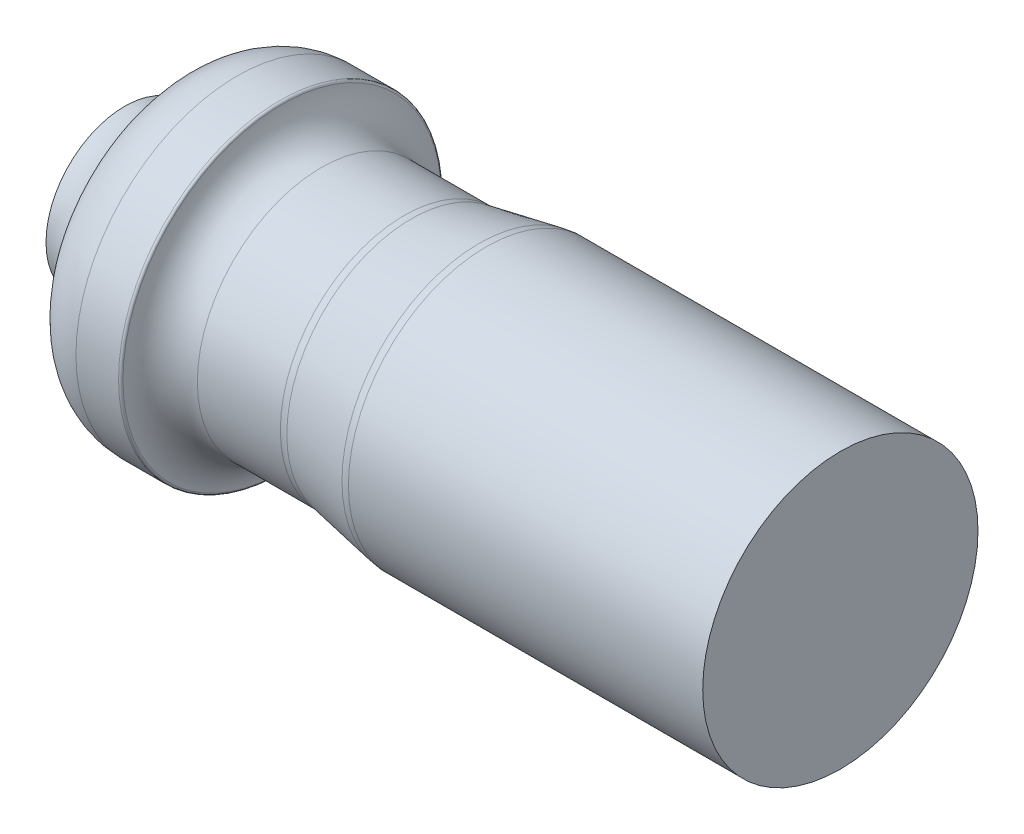
ISO-10303-21;
HEADER;
FILE_DESCRIPTION(('STEP AP214'),'2;1');
FILE_NAME('part.step','',(''),(''),'','','');
FILE_SCHEMA(('AUTOMOTIVE_DESIGN { 1 0 10303 214 1 1 1 1 }'));
ENDSEC;
DATA;
#1=APPLICATION_CONTEXT('core data for automotive mechanical design processes');
#2=APPLICATION_PROTOCOL_DEFINITION('international standard','automotive_design',2000,#1);
#3=PRODUCT_CONTEXT('',#1,'mechanical');
#4=PRODUCT('Part','Part','',(#3));
#5=PRODUCT_RELATED_PRODUCT_CATEGORY('part','',(#4));
#6=PRODUCT_DEFINITION_FORMATION('','',#4);
#7=PRODUCT_DEFINITION_CONTEXT('part definition',#1,'design');
#8=PRODUCT_DEFINITION('design','',#6,#7);
#9=PRODUCT_DEFINITION_SHAPE('','',#8);
#10=(LENGTH_UNIT() NAMED_UNIT(*) SI_UNIT(.MILLI.,.METRE.));
#11=(NAMED_UNIT(*) PLANE_ANGLE_UNIT() SI_UNIT($,.RADIAN.));
#12=(NAMED_UNIT(*) SI_UNIT($,.STERADIAN.) SOLID_ANGLE_UNIT());
#13=UNCERTAINTY_MEASURE_WITH_UNIT(LENGTH_MEASURE(1.E-05),#10,'distance_accuracy_value','');
#14=(GEOMETRIC_REPRESENTATION_CONTEXT(3) GLOBAL_UNCERTAINTY_ASSIGNED_CONTEXT((#13)) GLOBAL_UNIT_ASSIGNED_CONTEXT((#10,
#11,#12)) REPRESENTATION_CONTEXT('',''));
#15=CARTESIAN_POINT('',(0.,0.,0.));
#16=DIRECTION('',(0.,0.,1.));
#17=DIRECTION('',(1.,0.,0.));
#18=AXIS2_PLACEMENT_3D('',#15,#16,#17);
#19=CARTESIAN_POINT('',(-45.5,10.,0.));
#20=DIRECTION('',(1.,0.,0.));
#21=DIRECTION('',(0.,0.,-1.));
#22=AXIS2_PLACEMENT_3D('',#19,#20,#21);
#23=PLANE('',#22);
#24=CARTESIAN_POINT('',(-45.5,0.,0.));
#25=DIRECTION('',(-1.,0.,0.));
#26=DIRECTION('',(0.,0.,1.));
#27=AXIS2_PLACEMENT_3D('',#24,#25,#26);
#28=CIRCLE('',#27,10.);
#29=CARTESIAN_POINT('',(-45.5,0.,10.));
#30=VERTEX_POINT('',#29);
#31=EDGE_CURVE('E70',#30,#30,#28,.T.);
#32=ORIENTED_EDGE('',*,*,#31,.T.);
#33=EDGE_LOOP('',(#32));
#34=FACE_BOUND('',#33,.T.);
#35=ADVANCED_FACE('F41',(#34),#23,.F.);
#36=CARTESIAN_POINT('',(-45.5,0.,0.));
#37=DIRECTION('',(-1.,0.,0.));
#38=DIRECTION('',(0.,0.,1.));
#39=AXIS2_PLACEMENT_3D('',#36,#37,#38);
#40=TOROIDAL_SURFACE('',#39,17.,7.);
#41=ORIENTED_EDGE('',*,*,#31,.F.);
#42=EDGE_LOOP('',(#41));
#43=FACE_BOUND('',#42,.T.);
#44=CARTESIAN_POINT('',(-38.8224255900814,0.,0.));
#45=DIRECTION('',(-1.,0.,0.));
#46=DIRECTION('',(0.,0.,1.));
#47=AXIS2_PLACEMENT_3D('',#44,#45,#46);
#48=CIRCLE('',#47,14.9);
#49=CARTESIAN_POINT('',(-38.8224255900814,0.,14.9));
#50=VERTEX_POINT('',#49);
#51=EDGE_CURVE('E73',#50,#50,#48,.T.);
#52=ORIENTED_EDGE('',*,*,#51,.T.);
#53=EDGE_LOOP('',(#52));
#54=FACE_BOUND('',#53,.T.);
#55=ADVANCED_FACE('F99',(#43,#54),#40,.F.);
#56=CARTESIAN_POINT('',(-31.1909119787458,0.,0.));
#57=DIRECTION('',(-1.,0.,0.));
#58=DIRECTION('',(0.,0.,1.));
#59=AXIS2_PLACEMENT_3D('',#56,#57,#58);
#60=TOROIDAL_SURFACE('',#59,12.5,8.);
#61=ORIENTED_EDGE('',*,*,#51,.F.);
#62=EDGE_LOOP('',(#61));
#63=FACE_BOUND('',#62,.T.);
#64=CARTESIAN_POINT('',(-31.1909119787458,0.,0.));
#65=DIRECTION('',(-1.,0.,0.));
#66=DIRECTION('',(0.,0.,1.));
#67=AXIS2_PLACEMENT_3D('',#64,#65,#66);
#68=CIRCLE('',#67,20.5);
#69=CARTESIAN_POINT('',(-31.1909119787458,0.,20.5));
#70=VERTEX_POINT('',#69);
#71=EDGE_CURVE('E76',#70,#70,#68,.T.);
#72=ORIENTED_EDGE('',*,*,#71,.T.);
#73=EDGE_LOOP('',(#72));
#74=FACE_BOUND('',#73,.T.);
#75=ADVANCED_FACE('F105',(#63,#74),#60,.T.);
#76=CARTESIAN_POINT('',(0.,0.,0.));
#77=DIRECTION('',(-1.,0.,0.));
#78=DIRECTION('',(0.,0.,1.));
#79=AXIS2_PLACEMENT_3D('',#76,#77,#78);
#80=CYLINDRICAL_SURFACE('',#79,20.5);
#81=CARTESIAN_POINT('',(-25.7776389283821,0.,0.));
#82=DIRECTION('',(1.,0.,0.));
#83=DIRECTION('',(0.,0.,-1.));
#84=AXIS2_PLACEMENT_3D('',#81,#82,#83);
#85=CIRCLE('',#84,20.5);
#86=CARTESIAN_POINT('',(-25.7776389283821,0.,-20.5));
#87=VERTEX_POINT('',#86);
#88=EDGE_CURVE('E64',#87,#87,#85,.F.);
#89=ORIENTED_EDGE('',*,*,#88,.T.);
#90=EDGE_LOOP('',(#89));
#91=FACE_BOUND('',#90,.T.);
#92=ORIENTED_EDGE('',*,*,#71,.F.);
#93=EDGE_LOOP('',(#92));
#94=FACE_BOUND('',#93,.T.);
#95=ADVANCED_FACE('F131',(#91,#94),#80,.T.);
#96=CARTESIAN_POINT('',(0.,0.,0.));
#97=DIRECTION('',(-1.,0.,0.));
#98=DIRECTION('',(0.,0.,1.));
#99=AXIS2_PLACEMENT_3D('',#96,#97,#98);
#100=CYLINDRICAL_SURFACE('',#99,15.75);
#101=CARTESIAN_POINT('',(-9.95668440908969,0.,0.));
#102=DIRECTION('',(-1.,0.,0.));
#103=DIRECTION('',(0.,0.,1.));
#104=AXIS2_PLACEMENT_3D('',#101,#102,#103);
#105=CIRCLE('',#104,15.75);
#106=CARTESIAN_POINT('',(-9.95668440908969,0.,15.75));
#107=VERTEX_POINT('',#106);
#108=EDGE_CURVE('E10',#107,#107,#105,.T.);
#109=ORIENTED_EDGE('',*,*,#108,.T.);
#110=EDGE_LOOP('',(#109));
#111=FACE_BOUND('',#110,.T.);
#112=CARTESIAN_POINT('',(-20.5062539111405,0.,0.));
#113=DIRECTION('',(-1.,0.,0.));
#114=DIRECTION('',(0.,0.,1.));
#115=AXIS2_PLACEMENT_3D('',#112,#113,#114);
#116=CIRCLE('',#115,15.75);
#117=CARTESIAN_POINT('',(-20.5062539111405,0.,15.75));
#118=VERTEX_POINT('',#117);
#119=EDGE_CURVE('E67',#118,#118,#116,.F.);
#120=ORIENTED_EDGE('',*,*,#119,.T.);
#121=EDGE_LOOP('',(#120));
#122=FACE_BOUND('',#121,.T.);
#123=ADVANCED_FACE('F124',(#111,#122),#100,.T.);
#124=CARTESIAN_POINT('',(0.,0.,0.));
#125=DIRECTION('',(1.,0.,0.));
#126=DIRECTION('',(0.,0.,-1.));
#127=AXIS2_PLACEMENT_3D('',#124,#125,#126);
#128=CONICAL_SURFACE('',#127,17.5000000000063,0.1821683104734);
#129=CARTESIAN_POINT('',(-0.449127738315083,0.,0.));
#130=DIRECTION('',(-1.,0.,0.));
#131=DIRECTION('',(0.,0.,1.));
#132=AXIS2_PLACEMENT_3D('',#129,#130,#131);
#133=CIRCLE('',#132,17.4172659429479);
#134=CARTESIAN_POINT('',(-0.449127738315083,0.,17.4172659429479));
#135=VERTEX_POINT('',#134);
#136=EDGE_CURVE('E52',#135,#135,#133,.T.);
#137=ORIENTED_EDGE('',*,*,#136,.T.);
#138=EDGE_LOOP('',(#137));
#139=FACE_BOUND('',#138,.T.);
#140=CARTESIAN_POINT('',(-9.05087226170189,0.,0.));
#141=DIRECTION('',(1.,0.,0.));
#142=DIRECTION('',(0.,0.,-1.));
#143=AXIS2_PLACEMENT_3D('',#140,#141,#142);
#144=CIRCLE('',#143,15.8327340570552);
#145=CARTESIAN_POINT('',(-9.05087226170189,0.,-15.8327340570552));
#146=VERTEX_POINT('',#145);
#147=EDGE_CURVE('E56',#146,#146,#144,.T.);
#148=ORIENTED_EDGE('',*,*,#147,.T.);
#149=EDGE_LOOP('',(#148));
#150=FACE_BOUND('',#149,.T.);
#151=ADVANCED_FACE('F96',(#139,#150),#128,.T.);
#152=CARTESIAN_POINT('',(0.,0.,0.));
#153=DIRECTION('',(-1.,0.,0.));
#154=DIRECTION('',(0.,0.,1.));
#155=AXIS2_PLACEMENT_3D('',#152,#153,#154);
#156=CYLINDRICAL_SURFACE('',#155,17.5000000000031);
#157=CARTESIAN_POINT('',(0.456684409072705,0.,0.));
#158=DIRECTION('',(1.,0.,0.));
#159=DIRECTION('',(0.,0.,-1.));
#160=AXIS2_PLACEMENT_3D('',#157,#158,#159);
#161=CIRCLE('',#160,17.5000000000031);
#162=CARTESIAN_POINT('',(0.456684409072705,0.,-17.5000000000031));
#163=VERTEX_POINT('',#162);
#164=EDGE_CURVE('E48',#163,#163,#161,.T.);
#165=ORIENTED_EDGE('',*,*,#164,.T.);
#166=EDGE_LOOP('',(#165));
#167=FACE_BOUND('',#166,.T.);
#168=CARTESIAN_POINT('',(45.5,0.,0.));
#169=DIRECTION('',(-1.,0.,0.));
#170=DIRECTION('',(0.,0.,1.));
#171=AXIS2_PLACEMENT_3D('',#168,#169,#170);
#172=CIRCLE('',#171,17.5);
#173=CARTESIAN_POINT('',(45.5,0.,17.5));
#174=VERTEX_POINT('',#173);
#175=EDGE_CURVE('E79',#174,#174,#172,.T.);
#176=ORIENTED_EDGE('',*,*,#175,.T.);
#177=EDGE_LOOP('',(#176));
#178=FACE_BOUND('',#177,.T.);
#179=ADVANCED_FACE('F83',(#167,#178),#156,.T.);
#180=CARTESIAN_POINT('',(45.5,0.,0.));
#181=DIRECTION('',(-1.,0.,0.));
#182=DIRECTION('',(0.,0.,1.));
#183=AXIS2_PLACEMENT_3D('',#180,#181,#182);
#184=PLANE('',#183);
#185=ORIENTED_EDGE('',*,*,#175,.F.);
#186=EDGE_LOOP('',(#185));
#187=FACE_BOUND('',#186,.T.);
#188=ADVANCED_FACE('F85',(#187),#184,.F.);
#189=CARTESIAN_POINT('',(-20.5062539111405,0.,0.));
#190=DIRECTION('',(-1.,0.,0.));
#191=DIRECTION('',(0.,0.,1.));
#192=AXIS2_PLACEMENT_3D('',#189,#190,#191);
#193=TOROIDAL_SURFACE('',#192,20.75,5.);
#194=CARTESIAN_POINT('',(-25.4792586443862,0.,0.));
#195=DIRECTION('',(1.,0.,0.));
#196=DIRECTION('',(0.,0.,-1.));
#197=AXIS2_PLACEMENT_3D('',#194,#195,#196);
#198=CIRCLE('',#197,20.2311320754718);
#199=CARTESIAN_POINT('',(-25.4792586443862,0.,-20.2311320754718));
#200=VERTEX_POINT('',#199);
#201=EDGE_CURVE('E61',#200,#200,#198,.T.);
#202=ORIENTED_EDGE('',*,*,#201,.T.);
#203=EDGE_LOOP('',(#202));
#204=FACE_BOUND('',#203,.T.);
#205=ORIENTED_EDGE('',*,*,#119,.F.);
#206=EDGE_LOOP('',(#205));
#207=FACE_BOUND('',#206,.T.);
#208=ADVANCED_FACE('F87',(#204,#207),#193,.F.);
#209=CARTESIAN_POINT('',(-25.7776389283821,0.,0.));
#210=DIRECTION('',(1.,0.,0.));
#211=DIRECTION('',(0.,0.,-1.));
#212=AXIS2_PLACEMENT_3D('',#209,#210,#211);
#213=TOROIDAL_SURFACE('',#212,20.2,0.3);
#214=ORIENTED_EDGE('',*,*,#201,.F.);
#215=EDGE_LOOP('',(#214));
#216=FACE_BOUND('',#215,.T.);
#217=ORIENTED_EDGE('',*,*,#88,.F.);
#218=EDGE_LOOP('',(#217));
#219=FACE_BOUND('',#218,.T.);
#220=ADVANCED_FACE('F93',(#216,#219),#213,.T.);
#221=CARTESIAN_POINT('',(0.456684409072705,0.,0.));
#222=DIRECTION('',(1.,0.,0.));
#223=DIRECTION('',(0.,0.,-1.));
#224=AXIS2_PLACEMENT_3D('',#221,#222,#223);
#225=TOROIDAL_SURFACE('',#224,12.5000000000031,5.);
#226=ORIENTED_EDGE('',*,*,#164,.F.);
#227=EDGE_LOOP('',(#226));
#228=FACE_BOUND('',#227,.T.);
#229=ORIENTED_EDGE('',*,*,#136,.F.);
#230=EDGE_LOOP('',(#229));
#231=FACE_BOUND('',#230,.T.);
#232=ADVANCED_FACE('F111',(#228,#231),#225,.T.);
#233=CARTESIAN_POINT('',(-9.95668440908969,0.,0.));
#234=DIRECTION('',(-1.,0.,0.));
#235=DIRECTION('',(0.,0.,1.));
#236=AXIS2_PLACEMENT_3D('',#233,#234,#235);
#237=TOROIDAL_SURFACE('',#236,20.75,5.);
#238=ORIENTED_EDGE('',*,*,#147,.F.);
#239=EDGE_LOOP('',(#238));
#240=FACE_BOUND('',#239,.T.);
#241=ORIENTED_EDGE('',*,*,#108,.F.);
#242=EDGE_LOOP('',(#241));
#243=FACE_BOUND('',#242,.T.);
#244=ADVANCED_FACE('F43',(#240,#243),#237,.F.);
#245=CLOSED_SHELL('',(#35,#55,#75,#95,#123,#151,#179,#188,#208,#220,#232,#244));
#246=MANIFOLD_SOLID_BREP('B2',#245);
#247=ADVANCED_BREP_SHAPE_REPRESENTATION('',(#18,#246),#14);
#248=SHAPE_DEFINITION_REPRESENTATION(#9,#247);
ENDSEC;
END-ISO-10303-21;
